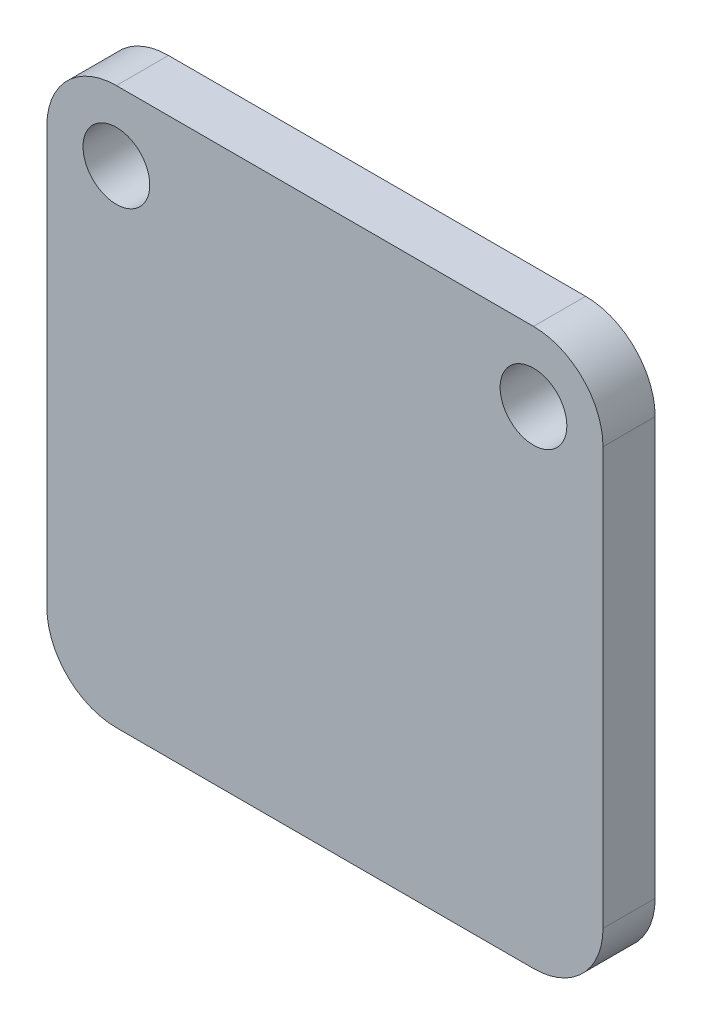
ISO-10303-21;
HEADER;
FILE_DESCRIPTION(('STEP AP214'),'2;1');
FILE_NAME('part.step','',(''),(''),'','','');
FILE_SCHEMA(('AUTOMOTIVE_DESIGN { 1 0 10303 214 1 1 1 1 }'));
ENDSEC;
DATA;
#1=APPLICATION_CONTEXT('core data for automotive mechanical design processes');
#2=APPLICATION_PROTOCOL_DEFINITION('international standard','automotive_design',2000,#1);
#3=PRODUCT_CONTEXT('',#1,'mechanical');
#4=PRODUCT('Part','Part','',(#3));
#5=PRODUCT_RELATED_PRODUCT_CATEGORY('part','',(#4));
#6=PRODUCT_DEFINITION_FORMATION('','',#4);
#7=PRODUCT_DEFINITION_CONTEXT('part definition',#1,'design');
#8=PRODUCT_DEFINITION('design','',#6,#7);
#9=PRODUCT_DEFINITION_SHAPE('','',#8);
#10=(LENGTH_UNIT() NAMED_UNIT(*) SI_UNIT(.MILLI.,.METRE.));
#11=(NAMED_UNIT(*) PLANE_ANGLE_UNIT() SI_UNIT($,.RADIAN.));
#12=(NAMED_UNIT(*) SI_UNIT($,.STERADIAN.) SOLID_ANGLE_UNIT());
#13=UNCERTAINTY_MEASURE_WITH_UNIT(LENGTH_MEASURE(1.E-05),#10,'distance_accuracy_value','');
#14=(GEOMETRIC_REPRESENTATION_CONTEXT(3) GLOBAL_UNCERTAINTY_ASSIGNED_CONTEXT((#13)) GLOBAL_UNIT_ASSIGNED_CONTEXT((#10,
#11,#12)) REPRESENTATION_CONTEXT('',''));
#15=CARTESIAN_POINT('',(0.,0.,0.));
#16=DIRECTION('',(0.,0.,1.));
#17=DIRECTION('',(1.,0.,0.));
#18=AXIS2_PLACEMENT_3D('',#15,#16,#17);
#19=CARTESIAN_POINT('',(-10.16,-10.16,1.905));
#20=DIRECTION('',(1.,0.,0.));
#21=DIRECTION('',(0.,0.,-1.));
#22=AXIS2_PLACEMENT_3D('',#19,#20,#21);
#23=PLANE('',#22);
#24=DIRECTION('',(0.,-1.,0.));
#25=VECTOR('',#24,1.);
#26=CARTESIAN_POINT('',(-10.16,-10.16,0.));
#27=LINE('',#26,#25);
#28=CARTESIAN_POINT('',(-10.16,7.62,0.));
#29=VERTEX_POINT('',#28);
#30=CARTESIAN_POINT('',(-10.16,-7.62,0.));
#31=VERTEX_POINT('',#30);
#32=EDGE_CURVE('E128',#29,#31,#27,.T.);
#33=ORIENTED_EDGE('',*,*,#32,.T.);
#34=DIRECTION('',(0.,0.,-1.));
#35=VECTOR('',#34,1.);
#36=CARTESIAN_POINT('',(-10.16,-7.62,1.905));
#37=LINE('',#36,#35);
#38=CARTESIAN_POINT('',(-10.16,-7.62,1.905));
#39=VERTEX_POINT('',#38);
#40=EDGE_CURVE('E106',#31,#39,#37,.F.);
#41=ORIENTED_EDGE('',*,*,#40,.T.);
#42=DIRECTION('',(0.,-1.,0.));
#43=VECTOR('',#42,1.);
#44=CARTESIAN_POINT('',(-10.16,-10.16,1.905));
#45=LINE('',#44,#43);
#46=CARTESIAN_POINT('',(-10.16,7.62,1.905));
#47=VERTEX_POINT('',#46);
#48=EDGE_CURVE('E138',#47,#39,#45,.T.);
#49=ORIENTED_EDGE('',*,*,#48,.F.);
#50=DIRECTION('',(0.,0.,-1.));
#51=VECTOR('',#50,1.);
#52=CARTESIAN_POINT('',(-10.16,7.62,1.905));
#53=LINE('',#52,#51);
#54=EDGE_CURVE('E111',#47,#29,#53,.T.);
#55=ORIENTED_EDGE('',*,*,#54,.T.);
#56=EDGE_LOOP('',(#33,#41,#49,#55));
#57=FACE_BOUND('',#56,.T.);
#58=ADVANCED_FACE('F36',(#57),#23,.F.);
#59=CARTESIAN_POINT('',(10.16,-10.16,1.905));
#60=DIRECTION('',(0.,1.,0.));
#61=DIRECTION('',(-1.,0.,0.));
#62=AXIS2_PLACEMENT_3D('',#59,#60,#61);
#63=PLANE('',#62);
#64=DIRECTION('',(1.,0.,0.));
#65=VECTOR('',#64,1.);
#66=CARTESIAN_POINT('',(10.16,-10.16,1.905));
#67=LINE('',#66,#65);
#68=CARTESIAN_POINT('',(-7.62,-10.16,1.905));
#69=VERTEX_POINT('',#68);
#70=CARTESIAN_POINT('',(7.62,-10.16,1.905));
#71=VERTEX_POINT('',#70);
#72=EDGE_CURVE('E121',#69,#71,#67,.T.);
#73=ORIENTED_EDGE('',*,*,#72,.F.);
#74=DIRECTION('',(0.,0.,-1.));
#75=VECTOR('',#74,1.);
#76=CARTESIAN_POINT('',(-7.62,-10.16,1.905));
#77=LINE('',#76,#75);
#78=CARTESIAN_POINT('',(-7.62,-10.16,0.));
#79=VERTEX_POINT('',#78);
#80=EDGE_CURVE('E105',#69,#79,#77,.T.);
#81=ORIENTED_EDGE('',*,*,#80,.T.);
#82=DIRECTION('',(1.,0.,0.));
#83=VECTOR('',#82,1.);
#84=CARTESIAN_POINT('',(10.16,-10.16,0.));
#85=LINE('',#84,#83);
#86=CARTESIAN_POINT('',(7.62,-10.16,0.));
#87=VERTEX_POINT('',#86);
#88=EDGE_CURVE('E118',#79,#87,#85,.T.);
#89=ORIENTED_EDGE('',*,*,#88,.T.);
#90=DIRECTION('',(0.,0.,-1.));
#91=VECTOR('',#90,1.);
#92=CARTESIAN_POINT('',(7.62,-10.16,1.905));
#93=LINE('',#92,#91);
#94=EDGE_CURVE('E123',#87,#71,#93,.F.);
#95=ORIENTED_EDGE('',*,*,#94,.T.);
#96=EDGE_LOOP('',(#73,#81,#89,#95));
#97=FACE_BOUND('',#96,.T.);
#98=ADVANCED_FACE('F117',(#97),#63,.F.);
#99=CARTESIAN_POINT('',(10.16,-10.16,1.905));
#100=DIRECTION('',(-1.,0.,0.));
#101=DIRECTION('',(0.,0.,1.));
#102=AXIS2_PLACEMENT_3D('',#99,#100,#101);
#103=PLANE('',#102);
#104=DIRECTION('',(0.,1.,0.));
#105=VECTOR('',#104,1.);
#106=CARTESIAN_POINT('',(10.16,-10.16,1.905));
#107=LINE('',#106,#105);
#108=CARTESIAN_POINT('',(10.16,-7.62,1.905));
#109=VERTEX_POINT('',#108);
#110=CARTESIAN_POINT('',(10.16,7.62,1.905));
#111=VERTEX_POINT('',#110);
#112=EDGE_CURVE('E172',#109,#111,#107,.T.);
#113=ORIENTED_EDGE('',*,*,#112,.F.);
#114=DIRECTION('',(0.,0.,-1.));
#115=VECTOR('',#114,1.);
#116=CARTESIAN_POINT('',(10.16,-7.62,1.905));
#117=LINE('',#116,#115);
#118=CARTESIAN_POINT('',(10.16,-7.62,0.));
#119=VERTEX_POINT('',#118);
#120=EDGE_CURVE('E157',#109,#119,#117,.T.);
#121=ORIENTED_EDGE('',*,*,#120,.T.);
#122=DIRECTION('',(0.,1.,0.));
#123=VECTOR('',#122,1.);
#124=CARTESIAN_POINT('',(10.16,-10.16,0.));
#125=LINE('',#124,#123);
#126=CARTESIAN_POINT('',(10.16,7.62,0.));
#127=VERTEX_POINT('',#126);
#128=EDGE_CURVE('E127',#119,#127,#125,.T.);
#129=ORIENTED_EDGE('',*,*,#128,.T.);
#130=DIRECTION('',(0.,0.,-1.));
#131=VECTOR('',#130,1.);
#132=CARTESIAN_POINT('',(10.16,7.62,1.905));
#133=LINE('',#132,#131);
#134=EDGE_CURVE('E155',#127,#111,#133,.F.);
#135=ORIENTED_EDGE('',*,*,#134,.T.);
#136=EDGE_LOOP('',(#113,#121,#129,#135));
#137=FACE_BOUND('',#136,.T.);
#138=ADVANCED_FACE('F189',(#137),#103,.F.);
#139=CARTESIAN_POINT('',(10.16,10.16,1.905));
#140=DIRECTION('',(0.,-1.,0.));
#141=DIRECTION('',(1.,0.,0.));
#142=AXIS2_PLACEMENT_3D('',#139,#140,#141);
#143=PLANE('',#142);
#144=DIRECTION('',(-1.,0.,0.));
#145=VECTOR('',#144,1.);
#146=CARTESIAN_POINT('',(10.16,10.16,0.));
#147=LINE('',#146,#145);
#148=CARTESIAN_POINT('',(7.62,10.16,0.));
#149=VERTEX_POINT('',#148);
#150=CARTESIAN_POINT('',(-7.62,10.16,0.));
#151=VERTEX_POINT('',#150);
#152=EDGE_CURVE('E131',#149,#151,#147,.T.);
#153=ORIENTED_EDGE('',*,*,#152,.T.);
#154=DIRECTION('',(0.,0.,-1.));
#155=VECTOR('',#154,1.);
#156=CARTESIAN_POINT('',(-7.62,10.16,1.905));
#157=LINE('',#156,#155);
#158=CARTESIAN_POINT('',(-7.62,10.16,1.905));
#159=VERTEX_POINT('',#158);
#160=EDGE_CURVE('E11',#151,#159,#157,.F.);
#161=ORIENTED_EDGE('',*,*,#160,.T.);
#162=DIRECTION('',(-1.,0.,0.));
#163=VECTOR('',#162,1.);
#164=CARTESIAN_POINT('',(10.16,10.16,1.905));
#165=LINE('',#164,#163);
#166=CARTESIAN_POINT('',(7.62,10.16,1.905));
#167=VERTEX_POINT('',#166);
#168=EDGE_CURVE('E139',#167,#159,#165,.T.);
#169=ORIENTED_EDGE('',*,*,#168,.F.);
#170=DIRECTION('',(0.,0.,-1.));
#171=VECTOR('',#170,1.);
#172=CARTESIAN_POINT('',(7.62,10.16,1.905));
#173=LINE('',#172,#171);
#174=EDGE_CURVE('E44',#167,#149,#173,.T.);
#175=ORIENTED_EDGE('',*,*,#174,.T.);
#176=EDGE_LOOP('',(#153,#161,#169,#175));
#177=FACE_BOUND('',#176,.T.);
#178=ADVANCED_FACE('F162',(#177),#143,.F.);
#179=CARTESIAN_POINT('',(0.,0.,1.905));
#180=DIRECTION('',(0.,0.,1.));
#181=DIRECTION('',(1.,0.,0.));
#182=AXIS2_PLACEMENT_3D('',#179,#180,#181);
#183=PLANE('',#182);
#184=CARTESIAN_POINT('',(-7.62,7.62,1.905));
#185=DIRECTION('',(0.,0.,1.));
#186=DIRECTION('',(1.,0.,0.));
#187=AXIS2_PLACEMENT_3D('',#184,#185,#186);
#188=CIRCLE('',#187,1.2192);
#189=CARTESIAN_POINT('',(-6.4008,7.62,1.905));
#190=VERTEX_POINT('',#189);
#191=EDGE_CURVE('E286',#190,#190,#188,.T.);
#192=ORIENTED_EDGE('',*,*,#191,.F.);
#193=EDGE_LOOP('',(#192));
#194=FACE_BOUND('',#193,.T.);
#195=CARTESIAN_POINT('',(7.62,7.62,1.905));
#196=DIRECTION('',(0.,0.,1.));
#197=DIRECTION('',(1.,0.,0.));
#198=AXIS2_PLACEMENT_3D('',#195,#196,#197);
#199=CIRCLE('',#198,1.2192);
#200=CARTESIAN_POINT('',(8.8392,7.62,1.905));
#201=VERTEX_POINT('',#200);
#202=EDGE_CURVE('E282',#201,#201,#199,.T.);
#203=ORIENTED_EDGE('',*,*,#202,.F.);
#204=EDGE_LOOP('',(#203));
#205=FACE_BOUND('',#204,.T.);
#206=ORIENTED_EDGE('',*,*,#48,.T.);
#207=CARTESIAN_POINT('',(-7.62,-7.62,1.905));
#208=DIRECTION('',(0.,0.,1.));
#209=DIRECTION('',(1.,0.,0.));
#210=AXIS2_PLACEMENT_3D('',#207,#208,#209);
#211=CIRCLE('',#210,2.54);
#212=EDGE_CURVE('E153',#39,#69,#211,.T.);
#213=ORIENTED_EDGE('',*,*,#212,.T.);
#214=ORIENTED_EDGE('',*,*,#72,.T.);
#215=CARTESIAN_POINT('',(7.62,-7.62,1.905));
#216=DIRECTION('',(0.,0.,1.));
#217=DIRECTION('',(1.,0.,0.));
#218=AXIS2_PLACEMENT_3D('',#215,#216,#217);
#219=CIRCLE('',#218,2.54);
#220=EDGE_CURVE('E151',#71,#109,#219,.T.);
#221=ORIENTED_EDGE('',*,*,#220,.T.);
#222=ORIENTED_EDGE('',*,*,#112,.T.);
#223=CARTESIAN_POINT('',(7.62,7.62,1.905));
#224=DIRECTION('',(0.,0.,1.));
#225=DIRECTION('',(1.,0.,0.));
#226=AXIS2_PLACEMENT_3D('',#223,#224,#225);
#227=CIRCLE('',#226,2.54);
#228=EDGE_CURVE('E56',#111,#167,#227,.T.);
#229=ORIENTED_EDGE('',*,*,#228,.T.);
#230=ORIENTED_EDGE('',*,*,#168,.T.);
#231=CARTESIAN_POINT('',(-7.62,7.62,1.905));
#232=DIRECTION('',(0.,0.,1.));
#233=DIRECTION('',(1.,0.,0.));
#234=AXIS2_PLACEMENT_3D('',#231,#232,#233);
#235=CIRCLE('',#234,2.54);
#236=EDGE_CURVE('E149',#159,#47,#235,.T.);
#237=ORIENTED_EDGE('',*,*,#236,.T.);
#238=EDGE_LOOP('',(#206,#213,#214,#221,#222,#229,#230,#237));
#239=FACE_BOUND('',#238,.T.);
#240=ADVANCED_FACE('F178',(#194,#205,#239),#183,.T.);
#241=CARTESIAN_POINT('',(0.,0.,0.));
#242=DIRECTION('',(0.,0.,1.));
#243=DIRECTION('',(1.,0.,0.));
#244=AXIS2_PLACEMENT_3D('',#241,#242,#243);
#245=PLANE('',#244);
#246=CARTESIAN_POINT('',(-7.62,7.62,0.));
#247=DIRECTION('',(0.,0.,1.));
#248=DIRECTION('',(1.,0.,0.));
#249=AXIS2_PLACEMENT_3D('',#246,#247,#248);
#250=CIRCLE('',#249,1.2192);
#251=CARTESIAN_POINT('',(-6.4008,7.62,0.));
#252=VERTEX_POINT('',#251);
#253=EDGE_CURVE('E133',#252,#252,#250,.F.);
#254=ORIENTED_EDGE('',*,*,#253,.F.);
#255=EDGE_LOOP('',(#254));
#256=FACE_BOUND('',#255,.T.);
#257=CARTESIAN_POINT('',(7.62,7.62,0.));
#258=DIRECTION('',(0.,0.,1.));
#259=DIRECTION('',(1.,0.,0.));
#260=AXIS2_PLACEMENT_3D('',#257,#258,#259);
#261=CIRCLE('',#260,1.2192);
#262=CARTESIAN_POINT('',(8.8392,7.62,0.));
#263=VERTEX_POINT('',#262);
#264=EDGE_CURVE('E175',#263,#263,#261,.F.);
#265=ORIENTED_EDGE('',*,*,#264,.F.);
#266=EDGE_LOOP('',(#265));
#267=FACE_BOUND('',#266,.T.);
#268=ORIENTED_EDGE('',*,*,#88,.F.);
#269=CARTESIAN_POINT('',(-7.62,-7.62,0.));
#270=DIRECTION('',(0.,0.,1.));
#271=DIRECTION('',(1.,0.,0.));
#272=AXIS2_PLACEMENT_3D('',#269,#270,#271);
#273=CIRCLE('',#272,2.54);
#274=EDGE_CURVE('E101',#79,#31,#273,.F.);
#275=ORIENTED_EDGE('',*,*,#274,.T.);
#276=ORIENTED_EDGE('',*,*,#32,.F.);
#277=CARTESIAN_POINT('',(-7.62,7.62,0.));
#278=DIRECTION('',(0.,0.,1.));
#279=DIRECTION('',(1.,0.,0.));
#280=AXIS2_PLACEMENT_3D('',#277,#278,#279);
#281=CIRCLE('',#280,2.54);
#282=EDGE_CURVE('E142',#29,#151,#281,.F.);
#283=ORIENTED_EDGE('',*,*,#282,.T.);
#284=ORIENTED_EDGE('',*,*,#152,.F.);
#285=CARTESIAN_POINT('',(7.62,7.62,0.));
#286=DIRECTION('',(0.,0.,1.));
#287=DIRECTION('',(1.,0.,0.));
#288=AXIS2_PLACEMENT_3D('',#285,#286,#287);
#289=CIRCLE('',#288,2.54);
#290=EDGE_CURVE('E122',#149,#127,#289,.F.);
#291=ORIENTED_EDGE('',*,*,#290,.T.);
#292=ORIENTED_EDGE('',*,*,#128,.F.);
#293=CARTESIAN_POINT('',(7.62,-7.62,0.));
#294=DIRECTION('',(0.,0.,1.));
#295=DIRECTION('',(1.,0.,0.));
#296=AXIS2_PLACEMENT_3D('',#293,#294,#295);
#297=CIRCLE('',#296,2.54);
#298=EDGE_CURVE('E112',#119,#87,#297,.F.);
#299=ORIENTED_EDGE('',*,*,#298,.T.);
#300=EDGE_LOOP('',(#268,#275,#276,#283,#284,#291,#292,#299));
#301=FACE_BOUND('',#300,.T.);
#302=ADVANCED_FACE('F125',(#256,#267,#301),#245,.F.);
#303=CARTESIAN_POINT('',(7.62,7.62,-0.000999999999999916));
#304=DIRECTION('',(0.,0.,1.));
#305=DIRECTION('',(1.,0.,0.));
#306=AXIS2_PLACEMENT_3D('',#303,#304,#305);
#307=CYLINDRICAL_SURFACE('',#306,1.2192);
#308=CARTESIAN_POINT('',(8.8392,7.62,1.905));
#309=CARTESIAN_POINT('',(8.8392,7.62,1.88515625));
#310=CARTESIAN_POINT('',(8.8392,7.62,1.8653125));
#311=CARTESIAN_POINT('',(8.8392,7.62,1.825625));
#312=CARTESIAN_POINT('',(8.8392,7.62,1.80578125));
#313=CARTESIAN_POINT('',(8.8392,7.62,1.76609375));
#314=CARTESIAN_POINT('',(8.8392,7.62,1.74625));
#315=CARTESIAN_POINT('',(8.8392,7.62,1.7065625));
#316=CARTESIAN_POINT('',(8.8392,7.62,1.68671875));
#317=CARTESIAN_POINT('',(8.8392,7.62,1.64703125));
#318=CARTESIAN_POINT('',(8.8392,7.62,1.6271875));
#319=CARTESIAN_POINT('',(8.8392,7.62,1.5875));
#320=CARTESIAN_POINT('',(8.8392,7.62,1.56765625));
#321=CARTESIAN_POINT('',(8.8392,7.62,1.52796875));
#322=CARTESIAN_POINT('',(8.8392,7.62,1.508125));
#323=CARTESIAN_POINT('',(8.8392,7.62,1.4684375));
#324=CARTESIAN_POINT('',(8.8392,7.62,1.44859375));
#325=CARTESIAN_POINT('',(8.8392,7.62,1.40890625));
#326=CARTESIAN_POINT('',(8.8392,7.62,1.3890625));
#327=CARTESIAN_POINT('',(8.8392,7.62,1.349375));
#328=CARTESIAN_POINT('',(8.8392,7.62,1.32953125));
#329=CARTESIAN_POINT('',(8.8392,7.62,1.28984375));
#330=CARTESIAN_POINT('',(8.8392,7.62,1.27));
#331=CARTESIAN_POINT('',(8.8392,7.62,1.2303125));
#332=CARTESIAN_POINT('',(8.8392,7.62,1.21046875));
#333=CARTESIAN_POINT('',(8.8392,7.62,1.17078125));
#334=CARTESIAN_POINT('',(8.8392,7.62,1.1509375));
#335=CARTESIAN_POINT('',(8.8392,7.62,1.11125));
#336=CARTESIAN_POINT('',(8.8392,7.62,1.09140625));
#337=CARTESIAN_POINT('',(8.8392,7.62,1.05171875));
#338=CARTESIAN_POINT('',(8.8392,7.62,1.031875));
#339=CARTESIAN_POINT('',(8.8392,7.62,0.9921875));
#340=CARTESIAN_POINT('',(8.8392,7.62,0.97234375));
#341=CARTESIAN_POINT('',(8.8392,7.62,0.93265625));
#342=CARTESIAN_POINT('',(8.8392,7.62,0.9128125));
#343=CARTESIAN_POINT('',(8.8392,7.62,0.873125));
#344=CARTESIAN_POINT('',(8.8392,7.62,0.85328125));
#345=CARTESIAN_POINT('',(8.8392,7.62,0.81359375));
#346=CARTESIAN_POINT('',(8.8392,7.62,0.79375));
#347=CARTESIAN_POINT('',(8.8392,7.62,0.7540625));
#348=CARTESIAN_POINT('',(8.8392,7.62,0.73421875));
#349=CARTESIAN_POINT('',(8.8392,7.62,0.69453125));
#350=CARTESIAN_POINT('',(8.8392,7.62,0.6746875));
#351=CARTESIAN_POINT('',(8.8392,7.62,0.635));
#352=CARTESIAN_POINT('',(8.8392,7.62,0.61515625));
#353=CARTESIAN_POINT('',(8.8392,7.62,0.57546875));
#354=CARTESIAN_POINT('',(8.8392,7.62,0.555625));
#355=CARTESIAN_POINT('',(8.8392,7.62,0.5159375));
#356=CARTESIAN_POINT('',(8.8392,7.62,0.49609375));
#357=CARTESIAN_POINT('',(8.8392,7.62,0.45640625));
#358=CARTESIAN_POINT('',(8.8392,7.62,0.4365625));
#359=CARTESIAN_POINT('',(8.8392,7.62,0.396875));
#360=CARTESIAN_POINT('',(8.8392,7.62,0.37703125));
#361=CARTESIAN_POINT('',(8.8392,7.62,0.33734375));
#362=CARTESIAN_POINT('',(8.8392,7.62,0.3175));
#363=CARTESIAN_POINT('',(8.8392,7.62,0.2778125));
#364=CARTESIAN_POINT('',(8.8392,7.62,0.25796875));
#365=CARTESIAN_POINT('',(8.8392,7.62,0.21828125));
#366=CARTESIAN_POINT('',(8.8392,7.62,0.1984375));
#367=CARTESIAN_POINT('',(8.8392,7.62,0.15875));
#368=CARTESIAN_POINT('',(8.8392,7.62,0.13890625));
#369=CARTESIAN_POINT('',(8.8392,7.62,0.09921875));
#370=CARTESIAN_POINT('',(8.8392,7.62,0.0793749999999999));
#371=CARTESIAN_POINT('',(8.8392,7.62,0.0396874999999999));
#372=CARTESIAN_POINT('',(8.8392,7.62,0.0198437499999999));
#373=CARTESIAN_POINT('',(8.8392,7.62,0.));
#374=B_SPLINE_CURVE_WITH_KNOTS('',3,(#308,#309,#310,#311,#312,#313,#314,#315,#316,#317,#318,
#319,#320,#321,#322,#323,#324,#325,#326,#327,#328,#329,#330,#331,#332,#333,#334,#335,#336,#337,
#338,#339,#340,#341,#342,#343,#344,#345,#346,#347,#348,#349,#350,#351,#352,#353,#354,#355,#356,
#357,#358,#359,#360,#361,#362,#363,#364,#365,#366,#367,#368,#369,#370,#371,#372,#373),
.UNSPECIFIED.,.F.,.F.,(4,2,2,2,2,2,2,2,2,2,2,2,2,2,2,2,2,2,2,2,2,2,2,2,2,2,2,2,2,2,2,2,4),(0.,
0.0595312499999999,0.1190625,0.17859375,0.238125,0.29765625,0.3571875,0.41671875,0.47625,
0.53578125,0.5953125,0.65484375,0.714375,0.77390625,0.8334375,0.89296875,0.9525,1.01203125,
1.0715625,1.13109375,1.190625,1.25015625,1.3096875,1.36921875,1.42875,1.48828125,1.5478125,
1.60734375,1.666875,1.72640625,1.7859375,1.84546875,1.905),.UNSPECIFIED.);
#375=EDGE_CURVE('BSEAM186',#201,#263,#374,.T.);
#376=ORIENTED_EDGE('',*,*,#202,.T.);
#377=ORIENTED_EDGE('',*,*,#264,.T.);
#378=ORIENTED_EDGE('',*,*,#375,.T.);
#379=ORIENTED_EDGE('',*,*,#375,.F.);
#380=EDGE_LOOP('',(#376,#378,#377,#379));
#381=FACE_BOUND('',#380,.T.);
#382=ADVANCED_FACE('F186',(#381),#307,.F.);
#383=CARTESIAN_POINT('',(-7.62,7.62,-0.000999999999999916));
#384=DIRECTION('',(0.,0.,1.));
#385=DIRECTION('',(1.,0.,0.));
#386=AXIS2_PLACEMENT_3D('',#383,#384,#385);
#387=CYLINDRICAL_SURFACE('',#386,1.2192);
#388=CARTESIAN_POINT('',(-6.4008,7.62,1.905));
#389=CARTESIAN_POINT('',(-6.4008,7.62,1.88515625));
#390=CARTESIAN_POINT('',(-6.4008,7.62,1.8653125));
#391=CARTESIAN_POINT('',(-6.4008,7.62,1.825625));
#392=CARTESIAN_POINT('',(-6.4008,7.62,1.80578125));
#393=CARTESIAN_POINT('',(-6.4008,7.62,1.76609375));
#394=CARTESIAN_POINT('',(-6.4008,7.62,1.74625));
#395=CARTESIAN_POINT('',(-6.4008,7.62,1.7065625));
#396=CARTESIAN_POINT('',(-6.4008,7.62,1.68671875));
#397=CARTESIAN_POINT('',(-6.4008,7.62,1.64703125));
#398=CARTESIAN_POINT('',(-6.4008,7.62,1.6271875));
#399=CARTESIAN_POINT('',(-6.4008,7.62,1.5875));
#400=CARTESIAN_POINT('',(-6.4008,7.62,1.56765625));
#401=CARTESIAN_POINT('',(-6.4008,7.62,1.52796875));
#402=CARTESIAN_POINT('',(-6.4008,7.62,1.508125));
#403=CARTESIAN_POINT('',(-6.4008,7.62,1.4684375));
#404=CARTESIAN_POINT('',(-6.4008,7.62,1.44859375));
#405=CARTESIAN_POINT('',(-6.4008,7.62,1.40890625));
#406=CARTESIAN_POINT('',(-6.4008,7.62,1.3890625));
#407=CARTESIAN_POINT('',(-6.4008,7.62,1.349375));
#408=CARTESIAN_POINT('',(-6.4008,7.62,1.32953125));
#409=CARTESIAN_POINT('',(-6.4008,7.62,1.28984375));
#410=CARTESIAN_POINT('',(-6.4008,7.62,1.27));
#411=CARTESIAN_POINT('',(-6.4008,7.62,1.2303125));
#412=CARTESIAN_POINT('',(-6.4008,7.62,1.21046875));
#413=CARTESIAN_POINT('',(-6.4008,7.62,1.17078125));
#414=CARTESIAN_POINT('',(-6.4008,7.62,1.1509375));
#415=CARTESIAN_POINT('',(-6.4008,7.62,1.11125));
#416=CARTESIAN_POINT('',(-6.4008,7.62,1.09140625));
#417=CARTESIAN_POINT('',(-6.4008,7.62,1.05171875));
#418=CARTESIAN_POINT('',(-6.4008,7.62,1.031875));
#419=CARTESIAN_POINT('',(-6.4008,7.62,0.9921875));
#420=CARTESIAN_POINT('',(-6.4008,7.62,0.97234375));
#421=CARTESIAN_POINT('',(-6.4008,7.62,0.93265625));
#422=CARTESIAN_POINT('',(-6.4008,7.62,0.9128125));
#423=CARTESIAN_POINT('',(-6.4008,7.62,0.873125));
#424=CARTESIAN_POINT('',(-6.4008,7.62,0.85328125));
#425=CARTESIAN_POINT('',(-6.4008,7.62,0.81359375));
#426=CARTESIAN_POINT('',(-6.4008,7.62,0.79375));
#427=CARTESIAN_POINT('',(-6.4008,7.62,0.7540625));
#428=CARTESIAN_POINT('',(-6.4008,7.62,0.73421875));
#429=CARTESIAN_POINT('',(-6.4008,7.62,0.69453125));
#430=CARTESIAN_POINT('',(-6.4008,7.62,0.6746875));
#431=CARTESIAN_POINT('',(-6.4008,7.62,0.635));
#432=CARTESIAN_POINT('',(-6.4008,7.62,0.61515625));
#433=CARTESIAN_POINT('',(-6.4008,7.62,0.57546875));
#434=CARTESIAN_POINT('',(-6.4008,7.62,0.555625));
#435=CARTESIAN_POINT('',(-6.4008,7.62,0.5159375));
#436=CARTESIAN_POINT('',(-6.4008,7.62,0.49609375));
#437=CARTESIAN_POINT('',(-6.4008,7.62,0.45640625));
#438=CARTESIAN_POINT('',(-6.4008,7.62,0.4365625));
#439=CARTESIAN_POINT('',(-6.4008,7.62,0.396875));
#440=CARTESIAN_POINT('',(-6.4008,7.62,0.37703125));
#441=CARTESIAN_POINT('',(-6.4008,7.62,0.33734375));
#442=CARTESIAN_POINT('',(-6.4008,7.62,0.3175));
#443=CARTESIAN_POINT('',(-6.4008,7.62,0.2778125));
#444=CARTESIAN_POINT('',(-6.4008,7.62,0.25796875));
#445=CARTESIAN_POINT('',(-6.4008,7.62,0.21828125));
#446=CARTESIAN_POINT('',(-6.4008,7.62,0.1984375));
#447=CARTESIAN_POINT('',(-6.4008,7.62,0.15875));
#448=CARTESIAN_POINT('',(-6.4008,7.62,0.13890625));
#449=CARTESIAN_POINT('',(-6.4008,7.62,0.09921875));
#450=CARTESIAN_POINT('',(-6.4008,7.62,0.0793749999999999));
#451=CARTESIAN_POINT('',(-6.4008,7.62,0.0396874999999999));
#452=CARTESIAN_POINT('',(-6.4008,7.62,0.0198437499999999));
#453=CARTESIAN_POINT('',(-6.4008,7.62,0.));
#454=B_SPLINE_CURVE_WITH_KNOTS('',3,(#388,#389,#390,#391,#392,#393,#394,#395,#396,#397,#398,
#399,#400,#401,#402,#403,#404,#405,#406,#407,#408,#409,#410,#411,#412,#413,#414,#415,#416,#417,
#418,#419,#420,#421,#422,#423,#424,#425,#426,#427,#428,#429,#430,#431,#432,#433,#434,#435,#436,
#437,#438,#439,#440,#441,#442,#443,#444,#445,#446,#447,#448,#449,#450,#451,#452,#453),
.UNSPECIFIED.,.F.,.F.,(4,2,2,2,2,2,2,2,2,2,2,2,2,2,2,2,2,2,2,2,2,2,2,2,2,2,2,2,2,2,2,2,4),(0.,
0.0595312499999999,0.1190625,0.17859375,0.238125,0.29765625,0.3571875,0.41671875,0.47625,
0.53578125,0.5953125,0.65484375,0.714375,0.77390625,0.8334375,0.89296875,0.9525,1.01203125,
1.0715625,1.13109375,1.190625,1.25015625,1.3096875,1.36921875,1.42875,1.48828125,1.5478125,
1.60734375,1.666875,1.72640625,1.7859375,1.84546875,1.905),.UNSPECIFIED.);
#455=EDGE_CURVE('BSEAM205',#190,#252,#454,.T.);
#456=ORIENTED_EDGE('',*,*,#191,.T.);
#457=ORIENTED_EDGE('',*,*,#253,.T.);
#458=ORIENTED_EDGE('',*,*,#455,.T.);
#459=ORIENTED_EDGE('',*,*,#455,.F.);
#460=EDGE_LOOP('',(#456,#458,#457,#459));
#461=FACE_BOUND('',#460,.T.);
#462=ADVANCED_FACE('F205',(#461),#387,.F.);
#463=CARTESIAN_POINT('',(-7.62,-7.62,1.905));
#464=DIRECTION('',(0.,0.,-1.));
#465=DIRECTION('',(-1.,0.,0.));
#466=AXIS2_PLACEMENT_3D('',#463,#464,#465);
#467=CYLINDRICAL_SURFACE('',#466,2.54);
#468=ORIENTED_EDGE('',*,*,#212,.F.);
#469=ORIENTED_EDGE('',*,*,#40,.F.);
#470=ORIENTED_EDGE('',*,*,#274,.F.);
#471=ORIENTED_EDGE('',*,*,#80,.F.);
#472=EDGE_LOOP('',(#468,#469,#470,#471));
#473=FACE_BOUND('',#472,.T.);
#474=ADVANCED_FACE('F104',(#473),#467,.T.);
#475=CARTESIAN_POINT('',(7.62,-7.62,1.905));
#476=DIRECTION('',(0.,0.,-1.));
#477=DIRECTION('',(-1.,0.,0.));
#478=AXIS2_PLACEMENT_3D('',#475,#476,#477);
#479=CYLINDRICAL_SURFACE('',#478,2.54);
#480=ORIENTED_EDGE('',*,*,#220,.F.);
#481=ORIENTED_EDGE('',*,*,#94,.F.);
#482=ORIENTED_EDGE('',*,*,#298,.F.);
#483=ORIENTED_EDGE('',*,*,#120,.F.);
#484=EDGE_LOOP('',(#480,#481,#482,#483));
#485=FACE_BOUND('',#484,.T.);
#486=ADVANCED_FACE('F204',(#485),#479,.T.);
#487=CARTESIAN_POINT('',(-7.62,7.62,1.905));
#488=DIRECTION('',(0.,0.,-1.));
#489=DIRECTION('',(-1.,0.,0.));
#490=AXIS2_PLACEMENT_3D('',#487,#488,#489);
#491=CYLINDRICAL_SURFACE('',#490,2.54);
#492=ORIENTED_EDGE('',*,*,#236,.F.);
#493=ORIENTED_EDGE('',*,*,#160,.F.);
#494=ORIENTED_EDGE('',*,*,#282,.F.);
#495=ORIENTED_EDGE('',*,*,#54,.F.);
#496=EDGE_LOOP('',(#492,#493,#494,#495));
#497=FACE_BOUND('',#496,.T.);
#498=ADVANCED_FACE('F167',(#497),#491,.T.);
#499=CARTESIAN_POINT('',(7.62,7.62,1.905));
#500=DIRECTION('',(0.,0.,-1.));
#501=DIRECTION('',(-1.,0.,0.));
#502=AXIS2_PLACEMENT_3D('',#499,#500,#501);
#503=CYLINDRICAL_SURFACE('',#502,2.54);
#504=ORIENTED_EDGE('',*,*,#228,.F.);
#505=ORIENTED_EDGE('',*,*,#134,.F.);
#506=ORIENTED_EDGE('',*,*,#290,.F.);
#507=ORIENTED_EDGE('',*,*,#174,.F.);
#508=EDGE_LOOP('',(#504,#505,#506,#507));
#509=FACE_BOUND('',#508,.T.);
#510=ADVANCED_FACE('F38',(#509),#503,.T.);
#511=CLOSED_SHELL('',(#58,#98,#138,#178,#240,#302,#382,#462,#474,#486,#498,#510));
#512=MANIFOLD_SOLID_BREP('B2',#511);
#513=ADVANCED_BREP_SHAPE_REPRESENTATION('',(#18,#512),#14);
#514=SHAPE_DEFINITION_REPRESENTATION(#9,#513);
ENDSEC;
END-ISO-10303-21;
